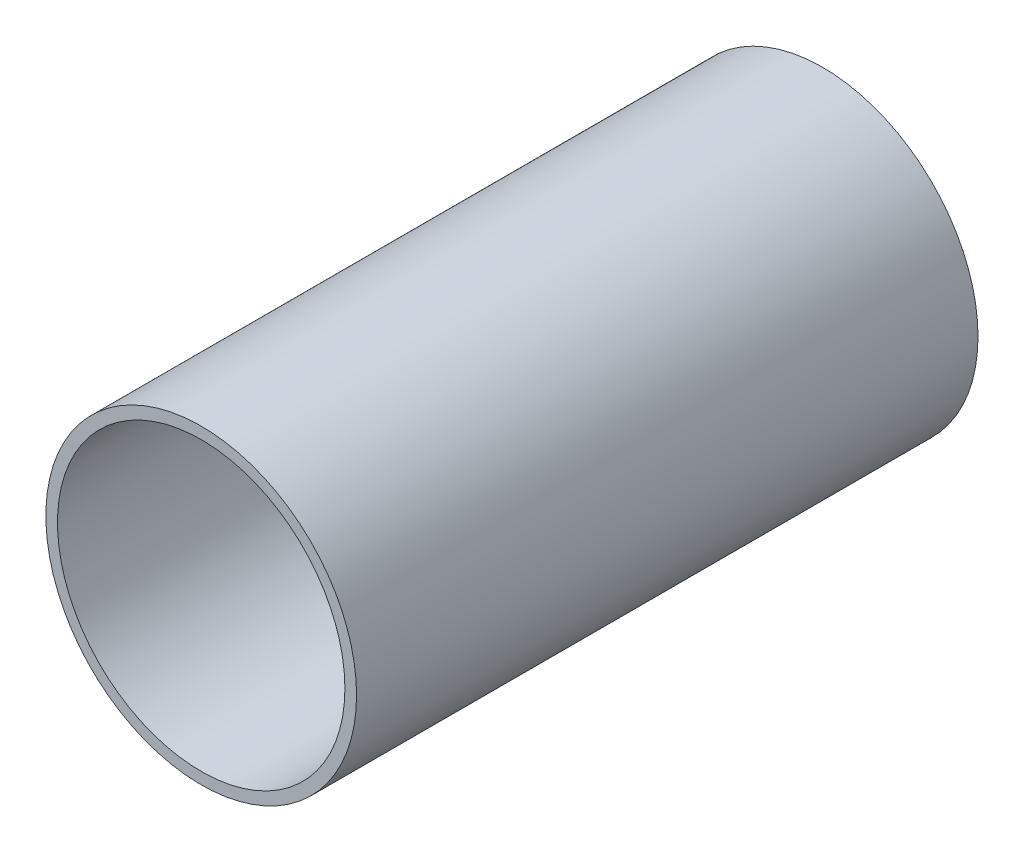
ISO-10303-21;
HEADER;
FILE_DESCRIPTION(('STEP AP214'),'2;1');
FILE_NAME('part.step','',(''),(''),'','','');
FILE_SCHEMA(('AUTOMOTIVE_DESIGN { 1 0 10303 214 1 1 1 1 }'));
ENDSEC;
DATA;
#1=APPLICATION_CONTEXT('core data for automotive mechanical design processes');
#2=APPLICATION_PROTOCOL_DEFINITION('international standard','automotive_design',2000,#1);
#3=PRODUCT_CONTEXT('',#1,'mechanical');
#4=PRODUCT('Part','Part','',(#3));
#5=PRODUCT_RELATED_PRODUCT_CATEGORY('part','',(#4));
#6=PRODUCT_DEFINITION_FORMATION('','',#4);
#7=PRODUCT_DEFINITION_CONTEXT('part definition',#1,'design');
#8=PRODUCT_DEFINITION('design','',#6,#7);
#9=PRODUCT_DEFINITION_SHAPE('','',#8);
#10=(LENGTH_UNIT() NAMED_UNIT(*) SI_UNIT(.MILLI.,.METRE.));
#11=(NAMED_UNIT(*) PLANE_ANGLE_UNIT() SI_UNIT($,.RADIAN.));
#12=(NAMED_UNIT(*) SI_UNIT($,.STERADIAN.) SOLID_ANGLE_UNIT());
#13=UNCERTAINTY_MEASURE_WITH_UNIT(LENGTH_MEASURE(1.E-05),#10,'distance_accuracy_value','');
#14=(GEOMETRIC_REPRESENTATION_CONTEXT(3) GLOBAL_UNCERTAINTY_ASSIGNED_CONTEXT((#13)) GLOBAL_UNIT_ASSIGNED_CONTEXT((#10,
#11,#12)) REPRESENTATION_CONTEXT('',''));
#15=CARTESIAN_POINT('',(0.,0.,0.));
#16=DIRECTION('',(0.,0.,1.));
#17=DIRECTION('',(1.,0.,0.));
#18=AXIS2_PLACEMENT_3D('',#15,#16,#17);
#19=CARTESIAN_POINT('',(0.,14.6834490981372,800.));
#20=DIRECTION('',(0.,0.,-1.));
#21=DIRECTION('',(-1.,0.,0.));
#22=AXIS2_PLACEMENT_3D('',#19,#20,#21);
#23=CYLINDRICAL_SURFACE('',#22,200.);
#24=CARTESIAN_POINT('',(0.,14.6834490981372,800.));
#25=DIRECTION('',(0.,0.,1.));
#26=DIRECTION('',(1.,0.,0.));
#27=AXIS2_PLACEMENT_3D('',#24,#25,#26);
#28=CIRCLE('',#27,200.);
#29=CARTESIAN_POINT('',(200.,14.6834490981372,800.));
#30=VERTEX_POINT('',#29);
#31=EDGE_CURVE('E10',#30,#30,#28,.T.);
#32=ORIENTED_EDGE('',*,*,#31,.F.);
#33=EDGE_LOOP('',(#32));
#34=FACE_BOUND('',#33,.T.);
#35=CARTESIAN_POINT('',(0.,14.6834490981372,0.));
#36=DIRECTION('',(0.,0.,1.));
#37=DIRECTION('',(1.,0.,0.));
#38=AXIS2_PLACEMENT_3D('',#35,#36,#37);
#39=CIRCLE('',#38,200.);
#40=CARTESIAN_POINT('',(200.,14.6834490981372,0.));
#41=VERTEX_POINT('',#40);
#42=EDGE_CURVE('E40',#41,#41,#39,.T.);
#43=ORIENTED_EDGE('',*,*,#42,.T.);
#44=EDGE_LOOP('',(#43));
#45=FACE_BOUND('',#44,.T.);
#46=ADVANCED_FACE('F37',(#34,#45),#23,.T.);
#47=CARTESIAN_POINT('',(0.,14.6834490981372,800.));
#48=DIRECTION('',(0.,0.,1.));
#49=DIRECTION('',(1.,0.,0.));
#50=AXIS2_PLACEMENT_3D('',#47,#48,#49);
#51=PLANE('',#50);
#52=CARTESIAN_POINT('',(0.,14.6834490981372,800.));
#53=DIRECTION('',(0.,0.,1.));
#54=DIRECTION('',(1.,0.,0.));
#55=AXIS2_PLACEMENT_3D('',#52,#53,#54);
#56=CIRCLE('',#55,185.);
#57=CARTESIAN_POINT('',(185.,14.6834490981372,800.));
#58=VERTEX_POINT('',#57);
#59=EDGE_CURVE('E49',#58,#58,#56,.T.);
#60=ORIENTED_EDGE('',*,*,#59,.F.);
#61=EDGE_LOOP('',(#60));
#62=FACE_BOUND('',#61,.T.);
#63=ORIENTED_EDGE('',*,*,#31,.T.);
#64=EDGE_LOOP('',(#63));
#65=FACE_BOUND('',#64,.T.);
#66=ADVANCED_FACE('F64',(#62,#65),#51,.T.);
#67=CARTESIAN_POINT('',(0.,14.6834490981372,0.));
#68=DIRECTION('',(0.,0.,1.));
#69=DIRECTION('',(1.,0.,0.));
#70=AXIS2_PLACEMENT_3D('',#67,#68,#69);
#71=PLANE('',#70);
#72=CARTESIAN_POINT('',(0.,14.6834490981372,0.));
#73=DIRECTION('',(0.,0.,1.));
#74=DIRECTION('',(1.,0.,0.));
#75=AXIS2_PLACEMENT_3D('',#72,#73,#74);
#76=CIRCLE('',#75,185.);
#77=CARTESIAN_POINT('',(185.,14.6834490981372,0.));
#78=VERTEX_POINT('',#77);
#79=EDGE_CURVE('E47',#78,#78,#76,.T.);
#80=ORIENTED_EDGE('',*,*,#79,.T.);
#81=EDGE_LOOP('',(#80));
#82=FACE_BOUND('',#81,.T.);
#83=ORIENTED_EDGE('',*,*,#42,.F.);
#84=EDGE_LOOP('',(#83));
#85=FACE_BOUND('',#84,.T.);
#86=ADVANCED_FACE('F55',(#82,#85),#71,.F.);
#87=CARTESIAN_POINT('',(0.,14.6834490981372,0.));
#88=DIRECTION('',(0.,0.,1.));
#89=DIRECTION('',(1.,0.,0.));
#90=AXIS2_PLACEMENT_3D('',#87,#88,#89);
#91=CYLINDRICAL_SURFACE('',#90,185.);
#92=ORIENTED_EDGE('',*,*,#79,.F.);
#93=EDGE_LOOP('',(#92));
#94=FACE_BOUND('',#93,.T.);
#95=ORIENTED_EDGE('',*,*,#59,.T.);
#96=EDGE_LOOP('',(#95));
#97=FACE_BOUND('',#96,.T.);
#98=ADVANCED_FACE('F58',(#94,#97),#91,.F.);
#99=CLOSED_SHELL('',(#46,#66,#86,#98));
#100=MANIFOLD_SOLID_BREP('B2',#99);
#101=ADVANCED_BREP_SHAPE_REPRESENTATION('',(#18,#100),#14);
#102=SHAPE_DEFINITION_REPRESENTATION(#9,#101);
ENDSEC;
END-ISO-10303-21;
